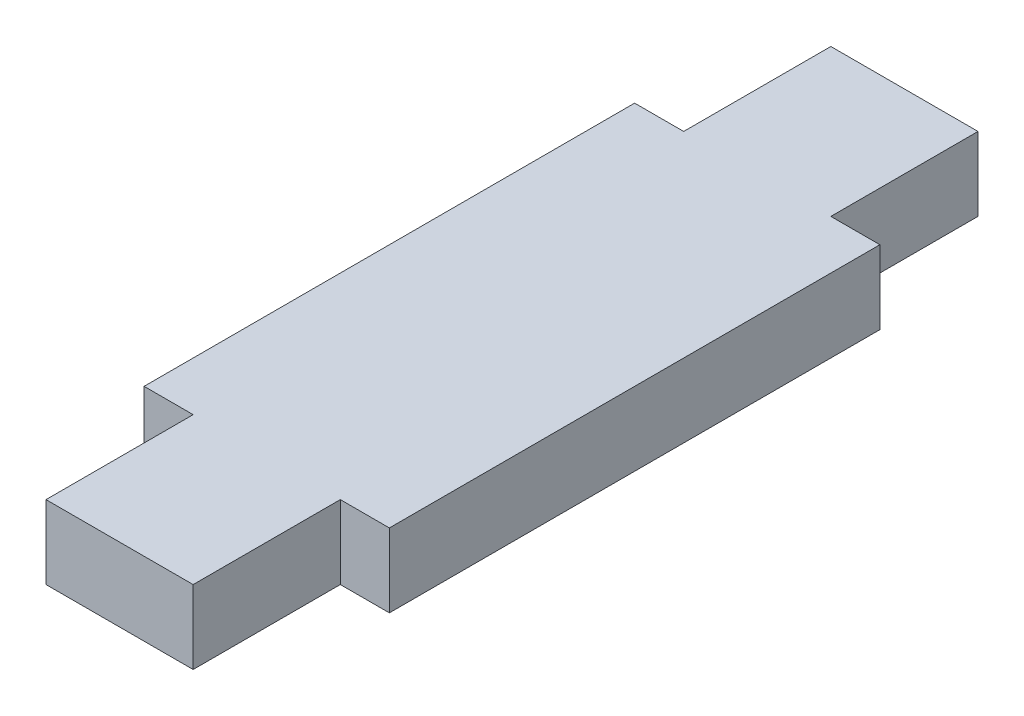
ISO-10303-21;
HEADER;
FILE_DESCRIPTION(('STEP AP214'),'2;1');
FILE_NAME('part.step','',(''),(''),'','','');
FILE_SCHEMA(('AUTOMOTIVE_DESIGN { 1 0 10303 214 1 1 1 1 }'));
ENDSEC;
DATA;
#1=APPLICATION_CONTEXT('core data for automotive mechanical design processes');
#2=APPLICATION_PROTOCOL_DEFINITION('international standard','automotive_design',2000,#1);
#3=PRODUCT_CONTEXT('',#1,'mechanical');
#4=PRODUCT('Part','Part','',(#3));
#5=PRODUCT_RELATED_PRODUCT_CATEGORY('part','',(#4));
#6=PRODUCT_DEFINITION_FORMATION('','',#4);
#7=PRODUCT_DEFINITION_CONTEXT('part definition',#1,'design');
#8=PRODUCT_DEFINITION('design','',#6,#7);
#9=PRODUCT_DEFINITION_SHAPE('','',#8);
#10=(LENGTH_UNIT() NAMED_UNIT(*) SI_UNIT(.MILLI.,.METRE.));
#11=(NAMED_UNIT(*) PLANE_ANGLE_UNIT() SI_UNIT($,.RADIAN.));
#12=(NAMED_UNIT(*) SI_UNIT($,.STERADIAN.) SOLID_ANGLE_UNIT());
#13=UNCERTAINTY_MEASURE_WITH_UNIT(LENGTH_MEASURE(1.E-05),#10,'distance_accuracy_value','');
#14=(GEOMETRIC_REPRESENTATION_CONTEXT(3) GLOBAL_UNCERTAINTY_ASSIGNED_CONTEXT((#13)) GLOBAL_UNIT_ASSIGNED_CONTEXT((#10,
#11,#12)) REPRESENTATION_CONTEXT('',''));
#15=CARTESIAN_POINT('',(0.,0.,0.));
#16=DIRECTION('',(0.,0.,1.));
#17=DIRECTION('',(1.,0.,0.));
#18=AXIS2_PLACEMENT_3D('',#15,#16,#17);
#19=CARTESIAN_POINT('',(3.,3.,9.99999999999999));
#20=DIRECTION('',(0.,0.,-1.));
#21=DIRECTION('',(-1.,0.,0.));
#22=AXIS2_PLACEMENT_3D('',#19,#20,#21);
#23=PLANE('',#22);
#24=DIRECTION('',(1.,0.,0.));
#25=VECTOR('',#24,1.);
#26=CARTESIAN_POINT('',(3.,0.,9.99999999999999));
#27=LINE('',#26,#25);
#28=CARTESIAN_POINT('',(3.,0.,9.99999999999999));
#29=VERTEX_POINT('',#28);
#30=CARTESIAN_POINT('',(5.,0.,10.));
#31=VERTEX_POINT('',#30);
#32=EDGE_CURVE('E154',#29,#31,#27,.T.);
#33=ORIENTED_EDGE('',*,*,#32,.T.);
#34=DIRECTION('',(0.,-1.,0.));
#35=VECTOR('',#34,1.);
#36=CARTESIAN_POINT('',(5.,3.,10.));
#37=LINE('',#36,#35);
#38=CARTESIAN_POINT('',(5.,3.,10.));
#39=VERTEX_POINT('',#38);
#40=EDGE_CURVE('E11',#39,#31,#37,.T.);
#41=ORIENTED_EDGE('',*,*,#40,.F.);
#42=DIRECTION('',(1.,0.,0.));
#43=VECTOR('',#42,1.);
#44=CARTESIAN_POINT('',(3.,3.,9.99999999999999));
#45=LINE('',#44,#43);
#46=CARTESIAN_POINT('',(3.,3.,9.99999999999999));
#47=VERTEX_POINT('',#46);
#48=EDGE_CURVE('E176',#47,#39,#45,.T.);
#49=ORIENTED_EDGE('',*,*,#48,.F.);
#50=DIRECTION('',(0.,-1.,0.));
#51=VECTOR('',#50,1.);
#52=CARTESIAN_POINT('',(3.,3.,9.99999999999999));
#53=LINE('',#52,#51);
#54=EDGE_CURVE('E150',#47,#29,#53,.T.);
#55=ORIENTED_EDGE('',*,*,#54,.T.);
#56=EDGE_LOOP('',(#33,#41,#49,#55));
#57=FACE_BOUND('',#56,.T.);
#58=ADVANCED_FACE('F34',(#57),#23,.F.);
#59=CARTESIAN_POINT('',(5.,3.,-10.));
#60=DIRECTION('',(-1.,0.,0.));
#61=DIRECTION('',(0.,0.,1.));
#62=AXIS2_PLACEMENT_3D('',#59,#60,#61);
#63=PLANE('',#62);
#64=DIRECTION('',(0.,0.,-1.));
#65=VECTOR('',#64,1.);
#66=CARTESIAN_POINT('',(5.,0.,-10.));
#67=LINE('',#66,#65);
#68=CARTESIAN_POINT('',(5.,0.,-10.));
#69=VERTEX_POINT('',#68);
#70=EDGE_CURVE('E157',#31,#69,#67,.T.);
#71=ORIENTED_EDGE('',*,*,#70,.T.);
#72=DIRECTION('',(0.,-1.,0.));
#73=VECTOR('',#72,1.);
#74=CARTESIAN_POINT('',(5.,3.,-10.));
#75=LINE('',#74,#73);
#76=CARTESIAN_POINT('',(5.,3.,-10.));
#77=VERTEX_POINT('',#76);
#78=EDGE_CURVE('E42',#77,#69,#75,.T.);
#79=ORIENTED_EDGE('',*,*,#78,.F.);
#80=DIRECTION('',(0.,0.,-1.));
#81=VECTOR('',#80,1.);
#82=CARTESIAN_POINT('',(5.,3.,-10.));
#83=LINE('',#82,#81);
#84=EDGE_CURVE('E105',#39,#77,#83,.T.);
#85=ORIENTED_EDGE('',*,*,#84,.F.);
#86=ORIENTED_EDGE('',*,*,#40,.T.);
#87=EDGE_LOOP('',(#71,#79,#85,#86));
#88=FACE_BOUND('',#87,.T.);
#89=ADVANCED_FACE('F254',(#88),#63,.F.);
#90=CARTESIAN_POINT('',(3.,3.,-10.));
#91=DIRECTION('',(0.,0.,1.));
#92=DIRECTION('',(1.,0.,0.));
#93=AXIS2_PLACEMENT_3D('',#90,#91,#92);
#94=PLANE('',#93);
#95=DIRECTION('',(-1.,0.,0.));
#96=VECTOR('',#95,1.);
#97=CARTESIAN_POINT('',(3.,0.,-10.));
#98=LINE('',#97,#96);
#99=CARTESIAN_POINT('',(3.,0.,-10.));
#100=VERTEX_POINT('',#99);
#101=EDGE_CURVE('E159',#69,#100,#98,.T.);
#102=ORIENTED_EDGE('',*,*,#101,.T.);
#103=DIRECTION('',(0.,-1.,0.));
#104=VECTOR('',#103,1.);
#105=CARTESIAN_POINT('',(3.,3.,-10.));
#106=LINE('',#105,#104);
#107=CARTESIAN_POINT('',(3.,3.,-10.));
#108=VERTEX_POINT('',#107);
#109=EDGE_CURVE('E195',#108,#100,#106,.T.);
#110=ORIENTED_EDGE('',*,*,#109,.F.);
#111=DIRECTION('',(-1.,0.,0.));
#112=VECTOR('',#111,1.);
#113=CARTESIAN_POINT('',(3.,3.,-10.));
#114=LINE('',#113,#112);
#115=EDGE_CURVE('E203',#77,#108,#114,.T.);
#116=ORIENTED_EDGE('',*,*,#115,.F.);
#117=ORIENTED_EDGE('',*,*,#78,.T.);
#118=EDGE_LOOP('',(#102,#110,#116,#117));
#119=FACE_BOUND('',#118,.T.);
#120=ADVANCED_FACE('F201',(#119),#94,.F.);
#121=CARTESIAN_POINT('',(3.,3.,-10.));
#122=DIRECTION('',(-1.,0.,0.));
#123=DIRECTION('',(0.,0.,1.));
#124=AXIS2_PLACEMENT_3D('',#121,#122,#123);
#125=PLANE('',#124);
#126=DIRECTION('',(0.,0.,-1.));
#127=VECTOR('',#126,1.);
#128=CARTESIAN_POINT('',(3.,0.,-10.));
#129=LINE('',#128,#127);
#130=CARTESIAN_POINT('',(3.,0.,-16.));
#131=VERTEX_POINT('',#130);
#132=EDGE_CURVE('E161',#100,#131,#129,.T.);
#133=ORIENTED_EDGE('',*,*,#132,.T.);
#134=DIRECTION('',(0.,-1.,0.));
#135=VECTOR('',#134,1.);
#136=CARTESIAN_POINT('',(3.,3.,-16.));
#137=LINE('',#136,#135);
#138=CARTESIAN_POINT('',(3.,3.,-16.));
#139=VERTEX_POINT('',#138);
#140=EDGE_CURVE('E192',#139,#131,#137,.T.);
#141=ORIENTED_EDGE('',*,*,#140,.F.);
#142=DIRECTION('',(0.,0.,-1.));
#143=VECTOR('',#142,1.);
#144=CARTESIAN_POINT('',(3.,3.,-10.));
#145=LINE('',#144,#143);
#146=EDGE_CURVE('E221',#108,#139,#145,.T.);
#147=ORIENTED_EDGE('',*,*,#146,.F.);
#148=ORIENTED_EDGE('',*,*,#109,.T.);
#149=EDGE_LOOP('',(#133,#141,#147,#148));
#150=FACE_BOUND('',#149,.T.);
#151=ADVANCED_FACE('F212',(#150),#125,.F.);
#152=CARTESIAN_POINT('',(-3.,3.,-16.));
#153=DIRECTION('',(0.,0.,1.));
#154=DIRECTION('',(1.,0.,0.));
#155=AXIS2_PLACEMENT_3D('',#152,#153,#154);
#156=PLANE('',#155);
#157=DIRECTION('',(-1.,0.,0.));
#158=VECTOR('',#157,1.);
#159=CARTESIAN_POINT('',(-3.,0.,-16.));
#160=LINE('',#159,#158);
#161=CARTESIAN_POINT('',(-3.,0.,-16.));
#162=VERTEX_POINT('',#161);
#163=EDGE_CURVE('E163',#131,#162,#160,.T.);
#164=ORIENTED_EDGE('',*,*,#163,.T.);
#165=DIRECTION('',(0.,-1.,0.));
#166=VECTOR('',#165,1.);
#167=CARTESIAN_POINT('',(-3.,3.,-16.));
#168=LINE('',#167,#166);
#169=CARTESIAN_POINT('',(-3.,3.,-16.));
#170=VERTEX_POINT('',#169);
#171=EDGE_CURVE('E189',#170,#162,#168,.T.);
#172=ORIENTED_EDGE('',*,*,#171,.F.);
#173=DIRECTION('',(-1.,0.,0.));
#174=VECTOR('',#173,1.);
#175=CARTESIAN_POINT('',(-3.,3.,-16.));
#176=LINE('',#175,#174);
#177=EDGE_CURVE('E218',#139,#170,#176,.T.);
#178=ORIENTED_EDGE('',*,*,#177,.F.);
#179=ORIENTED_EDGE('',*,*,#140,.T.);
#180=EDGE_LOOP('',(#164,#172,#178,#179));
#181=FACE_BOUND('',#180,.T.);
#182=ADVANCED_FACE('F216',(#181),#156,.F.);
#183=CARTESIAN_POINT('',(-3.,3.,-10.));
#184=DIRECTION('',(1.,0.,0.));
#185=DIRECTION('',(0.,0.,-1.));
#186=AXIS2_PLACEMENT_3D('',#183,#184,#185);
#187=PLANE('',#186);
#188=DIRECTION('',(0.,0.,1.));
#189=VECTOR('',#188,1.);
#190=CARTESIAN_POINT('',(-3.,0.,-10.));
#191=LINE('',#190,#189);
#192=CARTESIAN_POINT('',(-3.,0.,-10.));
#193=VERTEX_POINT('',#192);
#194=EDGE_CURVE('E165',#162,#193,#191,.T.);
#195=ORIENTED_EDGE('',*,*,#194,.T.);
#196=DIRECTION('',(0.,-1.,0.));
#197=VECTOR('',#196,1.);
#198=CARTESIAN_POINT('',(-3.,3.,-10.));
#199=LINE('',#198,#197);
#200=CARTESIAN_POINT('',(-3.,3.,-10.));
#201=VERTEX_POINT('',#200);
#202=EDGE_CURVE('E186',#201,#193,#199,.T.);
#203=ORIENTED_EDGE('',*,*,#202,.F.);
#204=DIRECTION('',(0.,0.,1.));
#205=VECTOR('',#204,1.);
#206=CARTESIAN_POINT('',(-3.,3.,-10.));
#207=LINE('',#206,#205);
#208=EDGE_CURVE('E220',#170,#201,#207,.T.);
#209=ORIENTED_EDGE('',*,*,#208,.F.);
#210=ORIENTED_EDGE('',*,*,#171,.T.);
#211=EDGE_LOOP('',(#195,#203,#209,#210));
#212=FACE_BOUND('',#211,.T.);
#213=ADVANCED_FACE('F267',(#212),#187,.F.);
#214=CARTESIAN_POINT('',(-5.,3.,-10.));
#215=DIRECTION('',(0.,0.,1.));
#216=DIRECTION('',(1.,0.,0.));
#217=AXIS2_PLACEMENT_3D('',#214,#215,#216);
#218=PLANE('',#217);
#219=DIRECTION('',(-1.,0.,0.));
#220=VECTOR('',#219,1.);
#221=CARTESIAN_POINT('',(-5.,0.,-10.));
#222=LINE('',#221,#220);
#223=CARTESIAN_POINT('',(-5.,0.,-10.));
#224=VERTEX_POINT('',#223);
#225=EDGE_CURVE('E167',#193,#224,#222,.T.);
#226=ORIENTED_EDGE('',*,*,#225,.T.);
#227=DIRECTION('',(0.,-1.,0.));
#228=VECTOR('',#227,1.);
#229=CARTESIAN_POINT('',(-5.,3.,-10.));
#230=LINE('',#229,#228);
#231=CARTESIAN_POINT('',(-5.,3.,-10.));
#232=VERTEX_POINT('',#231);
#233=EDGE_CURVE('E183',#232,#224,#230,.T.);
#234=ORIENTED_EDGE('',*,*,#233,.F.);
#235=DIRECTION('',(-1.,0.,0.));
#236=VECTOR('',#235,1.);
#237=CARTESIAN_POINT('',(-5.,3.,-10.));
#238=LINE('',#237,#236);
#239=EDGE_CURVE('E223',#201,#232,#238,.T.);
#240=ORIENTED_EDGE('',*,*,#239,.F.);
#241=ORIENTED_EDGE('',*,*,#202,.T.);
#242=EDGE_LOOP('',(#226,#234,#240,#241));
#243=FACE_BOUND('',#242,.T.);
#244=ADVANCED_FACE('F270',(#243),#218,.F.);
#245=CARTESIAN_POINT('',(-5.,3.,-10.));
#246=DIRECTION('',(1.,0.,0.));
#247=DIRECTION('',(0.,0.,-1.));
#248=AXIS2_PLACEMENT_3D('',#245,#246,#247);
#249=PLANE('',#248);
#250=DIRECTION('',(0.,0.,1.));
#251=VECTOR('',#250,1.);
#252=CARTESIAN_POINT('',(-5.,0.,-10.));
#253=LINE('',#252,#251);
#254=CARTESIAN_POINT('',(-5.,0.,10.));
#255=VERTEX_POINT('',#254);
#256=EDGE_CURVE('E169',#224,#255,#253,.T.);
#257=ORIENTED_EDGE('',*,*,#256,.T.);
#258=DIRECTION('',(0.,-1.,0.));
#259=VECTOR('',#258,1.);
#260=CARTESIAN_POINT('',(-5.,3.,10.));
#261=LINE('',#260,#259);
#262=CARTESIAN_POINT('',(-5.,3.,10.));
#263=VERTEX_POINT('',#262);
#264=EDGE_CURVE('E180',#263,#255,#261,.T.);
#265=ORIENTED_EDGE('',*,*,#264,.F.);
#266=DIRECTION('',(0.,0.,1.));
#267=VECTOR('',#266,1.);
#268=CARTESIAN_POINT('',(-5.,3.,-10.));
#269=LINE('',#268,#267);
#270=EDGE_CURVE('E229',#232,#263,#269,.T.);
#271=ORIENTED_EDGE('',*,*,#270,.F.);
#272=ORIENTED_EDGE('',*,*,#233,.T.);
#273=EDGE_LOOP('',(#257,#265,#271,#272));
#274=FACE_BOUND('',#273,.T.);
#275=ADVANCED_FACE('F235',(#274),#249,.F.);
#276=CARTESIAN_POINT('',(-5.,3.,10.));
#277=DIRECTION('',(0.,0.,-1.));
#278=DIRECTION('',(-1.,0.,0.));
#279=AXIS2_PLACEMENT_3D('',#276,#277,#278);
#280=PLANE('',#279);
#281=DIRECTION('',(1.,0.,0.));
#282=VECTOR('',#281,1.);
#283=CARTESIAN_POINT('',(-5.,0.,10.));
#284=LINE('',#283,#282);
#285=CARTESIAN_POINT('',(-3.,0.,10.));
#286=VERTEX_POINT('',#285);
#287=EDGE_CURVE('E171',#255,#286,#284,.T.);
#288=ORIENTED_EDGE('',*,*,#287,.T.);
#289=DIRECTION('',(0.,-1.,0.));
#290=VECTOR('',#289,1.);
#291=CARTESIAN_POINT('',(-3.,3.,10.));
#292=LINE('',#291,#290);
#293=CARTESIAN_POINT('',(-3.,3.,10.));
#294=VERTEX_POINT('',#293);
#295=EDGE_CURVE('E145',#294,#286,#292,.T.);
#296=ORIENTED_EDGE('',*,*,#295,.F.);
#297=DIRECTION('',(1.,0.,0.));
#298=VECTOR('',#297,1.);
#299=CARTESIAN_POINT('',(-5.,3.,10.));
#300=LINE('',#299,#298);
#301=EDGE_CURVE('E136',#263,#294,#300,.T.);
#302=ORIENTED_EDGE('',*,*,#301,.F.);
#303=ORIENTED_EDGE('',*,*,#264,.T.);
#304=EDGE_LOOP('',(#288,#296,#302,#303));
#305=FACE_BOUND('',#304,.T.);
#306=ADVANCED_FACE('F239',(#305),#280,.F.);
#307=CARTESIAN_POINT('',(-3.,3.,10.));
#308=DIRECTION('',(1.,0.,0.));
#309=DIRECTION('',(0.,0.,-1.));
#310=AXIS2_PLACEMENT_3D('',#307,#308,#309);
#311=PLANE('',#310);
#312=DIRECTION('',(0.,0.,1.));
#313=VECTOR('',#312,1.);
#314=CARTESIAN_POINT('',(-3.,0.,10.));
#315=LINE('',#314,#313);
#316=CARTESIAN_POINT('',(-3.,0.,16.));
#317=VERTEX_POINT('',#316);
#318=EDGE_CURVE('E144',#286,#317,#315,.T.);
#319=ORIENTED_EDGE('',*,*,#318,.T.);
#320=DIRECTION('',(0.,-1.,0.));
#321=VECTOR('',#320,1.);
#322=CARTESIAN_POINT('',(-3.,3.,16.));
#323=LINE('',#322,#321);
#324=CARTESIAN_POINT('',(-3.,3.,16.));
#325=VERTEX_POINT('',#324);
#326=EDGE_CURVE('E141',#325,#317,#323,.T.);
#327=ORIENTED_EDGE('',*,*,#326,.F.);
#328=DIRECTION('',(0.,0.,1.));
#329=VECTOR('',#328,1.);
#330=CARTESIAN_POINT('',(-3.,3.,10.));
#331=LINE('',#330,#329);
#332=EDGE_CURVE('E130',#294,#325,#331,.T.);
#333=ORIENTED_EDGE('',*,*,#332,.F.);
#334=ORIENTED_EDGE('',*,*,#295,.T.);
#335=EDGE_LOOP('',(#319,#327,#333,#334));
#336=FACE_BOUND('',#335,.T.);
#337=ADVANCED_FACE('F142',(#336),#311,.F.);
#338=CARTESIAN_POINT('',(-3.,3.,16.));
#339=DIRECTION('',(0.,0.,-1.));
#340=DIRECTION('',(-1.,0.,0.));
#341=AXIS2_PLACEMENT_3D('',#338,#339,#340);
#342=PLANE('',#341);
#343=DIRECTION('',(1.,0.,0.));
#344=VECTOR('',#343,1.);
#345=CARTESIAN_POINT('',(-3.,0.,16.));
#346=LINE('',#345,#344);
#347=CARTESIAN_POINT('',(3.,0.,16.));
#348=VERTEX_POINT('',#347);
#349=EDGE_CURVE('E91',#317,#348,#346,.T.);
#350=ORIENTED_EDGE('',*,*,#349,.T.);
#351=DIRECTION('',(0.,-1.,0.));
#352=VECTOR('',#351,1.);
#353=CARTESIAN_POINT('',(3.,3.,16.));
#354=LINE('',#353,#352);
#355=CARTESIAN_POINT('',(3.,3.,16.));
#356=VERTEX_POINT('',#355);
#357=EDGE_CURVE('E146',#356,#348,#354,.T.);
#358=ORIENTED_EDGE('',*,*,#357,.F.);
#359=DIRECTION('',(1.,0.,0.));
#360=VECTOR('',#359,1.);
#361=CARTESIAN_POINT('',(-3.,3.,16.));
#362=LINE('',#361,#360);
#363=EDGE_CURVE('E134',#325,#356,#362,.T.);
#364=ORIENTED_EDGE('',*,*,#363,.F.);
#365=ORIENTED_EDGE('',*,*,#326,.T.);
#366=EDGE_LOOP('',(#350,#358,#364,#365));
#367=FACE_BOUND('',#366,.T.);
#368=ADVANCED_FACE('F148',(#367),#342,.F.);
#369=CARTESIAN_POINT('',(3.,3.,9.99999999999999));
#370=DIRECTION('',(-1.,0.,0.));
#371=DIRECTION('',(0.,0.,1.));
#372=AXIS2_PLACEMENT_3D('',#369,#370,#371);
#373=PLANE('',#372);
#374=DIRECTION('',(0.,0.,-1.));
#375=VECTOR('',#374,1.);
#376=CARTESIAN_POINT('',(3.,0.,9.99999999999999));
#377=LINE('',#376,#375);
#378=EDGE_CURVE('E97',#348,#29,#377,.T.);
#379=ORIENTED_EDGE('',*,*,#378,.T.);
#380=ORIENTED_EDGE('',*,*,#54,.F.);
#381=DIRECTION('',(0.,0.,-1.));
#382=VECTOR('',#381,1.);
#383=CARTESIAN_POINT('',(3.,3.,9.99999999999999));
#384=LINE('',#383,#382);
#385=EDGE_CURVE('E50',#356,#47,#384,.T.);
#386=ORIENTED_EDGE('',*,*,#385,.F.);
#387=ORIENTED_EDGE('',*,*,#357,.T.);
#388=EDGE_LOOP('',(#379,#380,#386,#387));
#389=FACE_BOUND('',#388,.T.);
#390=ADVANCED_FACE('F243',(#389),#373,.F.);
#391=CARTESIAN_POINT('',(0.,3.,0.));
#392=DIRECTION('',(0.,-1.,0.));
#393=DIRECTION('',(0.,0.,-1.));
#394=AXIS2_PLACEMENT_3D('',#391,#392,#393);
#395=PLANE('',#394);
#396=ORIENTED_EDGE('',*,*,#48,.T.);
#397=ORIENTED_EDGE('',*,*,#84,.T.);
#398=ORIENTED_EDGE('',*,*,#115,.T.);
#399=ORIENTED_EDGE('',*,*,#146,.T.);
#400=ORIENTED_EDGE('',*,*,#177,.T.);
#401=ORIENTED_EDGE('',*,*,#208,.T.);
#402=ORIENTED_EDGE('',*,*,#239,.T.);
#403=ORIENTED_EDGE('',*,*,#270,.T.);
#404=ORIENTED_EDGE('',*,*,#301,.T.);
#405=ORIENTED_EDGE('',*,*,#332,.T.);
#406=ORIENTED_EDGE('',*,*,#363,.T.);
#407=ORIENTED_EDGE('',*,*,#385,.T.);
#408=EDGE_LOOP('',(#396,#397,#398,#399,#400,#401,#402,#403,#404,#405,#406,#407));
#409=FACE_BOUND('',#408,.T.);
#410=ADVANCED_FACE('F132',(#409),#395,.F.);
#411=CARTESIAN_POINT('',(0.,0.,0.));
#412=DIRECTION('',(0.,-1.,0.));
#413=DIRECTION('',(0.,0.,-1.));
#414=AXIS2_PLACEMENT_3D('',#411,#412,#413);
#415=PLANE('',#414);
#416=ORIENTED_EDGE('',*,*,#32,.F.);
#417=ORIENTED_EDGE('',*,*,#378,.F.);
#418=ORIENTED_EDGE('',*,*,#349,.F.);
#419=ORIENTED_EDGE('',*,*,#318,.F.);
#420=ORIENTED_EDGE('',*,*,#287,.F.);
#421=ORIENTED_EDGE('',*,*,#256,.F.);
#422=ORIENTED_EDGE('',*,*,#225,.F.);
#423=ORIENTED_EDGE('',*,*,#194,.F.);
#424=ORIENTED_EDGE('',*,*,#163,.F.);
#425=ORIENTED_EDGE('',*,*,#132,.F.);
#426=ORIENTED_EDGE('',*,*,#101,.F.);
#427=ORIENTED_EDGE('',*,*,#70,.F.);
#428=EDGE_LOOP('',(#416,#417,#418,#419,#420,#421,#422,#423,#424,#425,#426,#427));
#429=FACE_BOUND('',#428,.T.);
#430=ADVANCED_FACE('F207',(#429),#415,.T.);
#431=CLOSED_SHELL('',(#58,#89,#120,#151,#182,#213,#244,#275,#306,#337,#368,#390,#410,#430));
#432=MANIFOLD_SOLID_BREP('B2',#431);
#433=ADVANCED_BREP_SHAPE_REPRESENTATION('',(#18,#432),#14);
#434=SHAPE_DEFINITION_REPRESENTATION(#9,#433);
ENDSEC;
END-ISO-10303-21;
